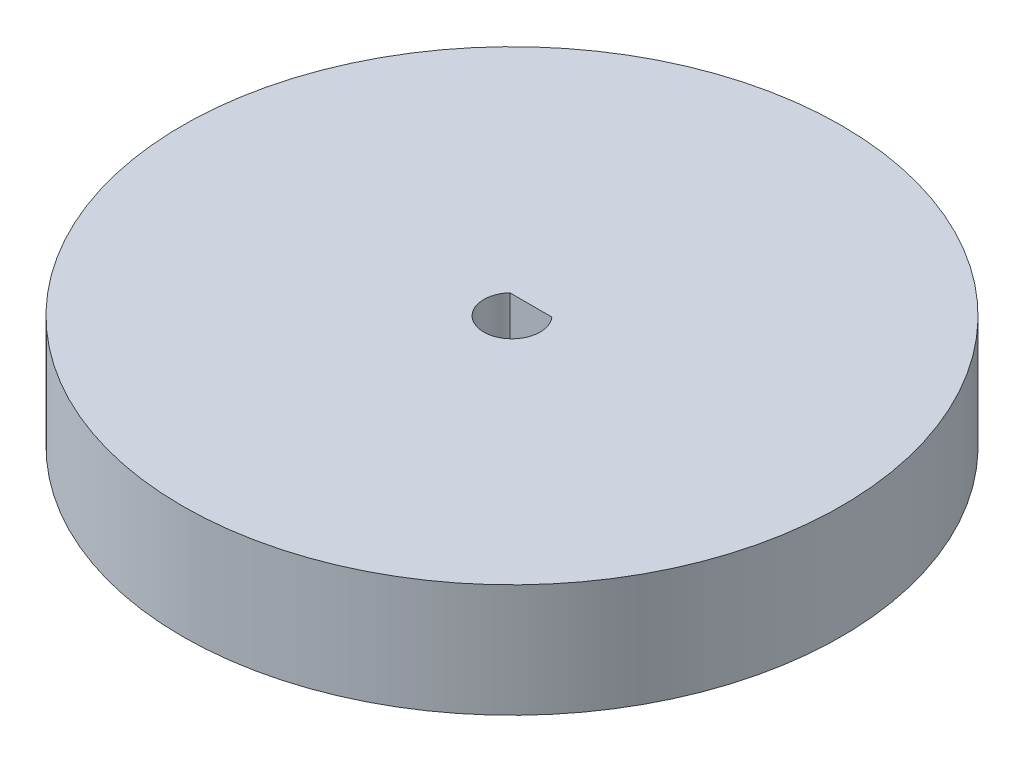
ISO-10303-21;
HEADER;
FILE_DESCRIPTION(('STEP AP214'),'2;1');
FILE_NAME('part.step','',(''),(''),'','','');
FILE_SCHEMA(('AUTOMOTIVE_DESIGN { 1 0 10303 214 1 1 1 1 }'));
ENDSEC;
DATA;
#1=APPLICATION_CONTEXT('core data for automotive mechanical design processes');
#2=APPLICATION_PROTOCOL_DEFINITION('international standard','automotive_design',2000,#1);
#3=PRODUCT_CONTEXT('',#1,'mechanical');
#4=PRODUCT('Part','Part','',(#3));
#5=PRODUCT_RELATED_PRODUCT_CATEGORY('part','',(#4));
#6=PRODUCT_DEFINITION_FORMATION('','',#4);
#7=PRODUCT_DEFINITION_CONTEXT('part definition',#1,'design');
#8=PRODUCT_DEFINITION('design','',#6,#7);
#9=PRODUCT_DEFINITION_SHAPE('','',#8);
#10=(LENGTH_UNIT() NAMED_UNIT(*) SI_UNIT(.MILLI.,.METRE.));
#11=(NAMED_UNIT(*) PLANE_ANGLE_UNIT() SI_UNIT($,.RADIAN.));
#12=(NAMED_UNIT(*) SI_UNIT($,.STERADIAN.) SOLID_ANGLE_UNIT());
#13=UNCERTAINTY_MEASURE_WITH_UNIT(LENGTH_MEASURE(1.E-05),#10,'distance_accuracy_value','');
#14=(GEOMETRIC_REPRESENTATION_CONTEXT(3) GLOBAL_UNCERTAINTY_ASSIGNED_CONTEXT((#13)) GLOBAL_UNIT_ASSIGNED_CONTEXT((#10,
#11,#12)) REPRESENTATION_CONTEXT('',''));
#15=CARTESIAN_POINT('',(0.,0.,0.));
#16=DIRECTION('',(0.,0.,1.));
#17=DIRECTION('',(1.,0.,0.));
#18=AXIS2_PLACEMENT_3D('',#15,#16,#17);
#19=CARTESIAN_POINT('',(0.,6.,0.));
#20=DIRECTION('',(0.,-1.,0.));
#21=DIRECTION('',(0.,0.,-1.));
#22=AXIS2_PLACEMENT_3D('',#19,#20,#21);
#23=CYLINDRICAL_SURFACE('',#22,1.5);
#24=CARTESIAN_POINT('',(0.,0.,0.));
#25=DIRECTION('',(0.,1.,0.));
#26=DIRECTION('',(0.,0.,1.));
#27=AXIS2_PLACEMENT_3D('',#24,#25,#26);
#28=CIRCLE('',#27,1.5);
#29=CARTESIAN_POINT('',(-1.11803398874989,0.,-1.));
#30=VERTEX_POINT('',#29);
#31=CARTESIAN_POINT('',(1.11803398874989,0.,-1.));
#32=VERTEX_POINT('',#31);
#33=EDGE_CURVE('E63',#30,#32,#28,.T.);
#34=ORIENTED_EDGE('',*,*,#33,.F.);
#35=DIRECTION('',(0.,-1.,0.));
#36=VECTOR('',#35,1.);
#37=CARTESIAN_POINT('',(-1.11803398874989,6.,-1.));
#38=LINE('',#37,#36);
#39=CARTESIAN_POINT('',(-1.11803398874989,6.,-1.));
#40=VERTEX_POINT('',#39);
#41=EDGE_CURVE('E11',#40,#30,#38,.T.);
#42=ORIENTED_EDGE('',*,*,#41,.F.);
#43=CARTESIAN_POINT('',(0.,6.,0.));
#44=DIRECTION('',(0.,1.,0.));
#45=DIRECTION('',(0.,0.,1.));
#46=AXIS2_PLACEMENT_3D('',#43,#44,#45);
#47=CIRCLE('',#46,1.5);
#48=CARTESIAN_POINT('',(1.11803398874989,6.,-1.));
#49=VERTEX_POINT('',#48);
#50=EDGE_CURVE('E64',#40,#49,#47,.T.);
#51=ORIENTED_EDGE('',*,*,#50,.T.);
#52=DIRECTION('',(0.,-1.,0.));
#53=VECTOR('',#52,1.);
#54=CARTESIAN_POINT('',(1.11803398874989,6.,-1.));
#55=LINE('',#54,#53);
#56=EDGE_CURVE('E43',#49,#32,#55,.T.);
#57=ORIENTED_EDGE('',*,*,#56,.T.);
#58=EDGE_LOOP('',(#34,#42,#51,#57));
#59=FACE_BOUND('',#58,.T.);
#60=ADVANCED_FACE('F35',(#59),#23,.F.);
#61=CARTESIAN_POINT('',(0.,6.,-1.));
#62=DIRECTION('',(0.,0.,-1.));
#63=DIRECTION('',(-1.,0.,0.));
#64=AXIS2_PLACEMENT_3D('',#61,#62,#63);
#65=PLANE('',#64);
#66=DIRECTION('',(1.,0.,0.));
#67=VECTOR('',#66,1.);
#68=CARTESIAN_POINT('',(0.,0.,-1.));
#69=LINE('',#68,#67);
#70=EDGE_CURVE('E66',#30,#32,#69,.T.);
#71=ORIENTED_EDGE('',*,*,#70,.T.);
#72=ORIENTED_EDGE('',*,*,#56,.F.);
#73=DIRECTION('',(1.,0.,0.));
#74=VECTOR('',#73,1.);
#75=CARTESIAN_POINT('',(0.,6.,-1.));
#76=LINE('',#75,#74);
#77=EDGE_CURVE('E50',#40,#49,#76,.T.);
#78=ORIENTED_EDGE('',*,*,#77,.F.);
#79=ORIENTED_EDGE('',*,*,#41,.T.);
#80=EDGE_LOOP('',(#71,#72,#78,#79));
#81=FACE_BOUND('',#80,.T.);
#82=ADVANCED_FACE('F67',(#81),#65,.F.);
#83=CARTESIAN_POINT('',(0.,6.,0.));
#84=DIRECTION('',(0.,-1.,0.));
#85=DIRECTION('',(0.,0.,-1.));
#86=AXIS2_PLACEMENT_3D('',#83,#84,#85);
#87=CYLINDRICAL_SURFACE('',#86,17.5);
#88=CARTESIAN_POINT('',(0.,6.,0.));
#89=DIRECTION('',(0.,1.,0.));
#90=DIRECTION('',(0.,0.,1.));
#91=AXIS2_PLACEMENT_3D('',#88,#89,#90);
#92=CIRCLE('',#91,17.5);
#93=CARTESIAN_POINT('',(0.,6.,17.5));
#94=VERTEX_POINT('',#93);
#95=EDGE_CURVE('E65',#94,#94,#92,.T.);
#96=ORIENTED_EDGE('',*,*,#95,.F.);
#97=EDGE_LOOP('',(#96));
#98=FACE_BOUND('',#97,.T.);
#99=CARTESIAN_POINT('',(0.,0.,0.));
#100=DIRECTION('',(0.,1.,0.));
#101=DIRECTION('',(0.,0.,1.));
#102=AXIS2_PLACEMENT_3D('',#99,#100,#101);
#103=CIRCLE('',#102,17.5);
#104=CARTESIAN_POINT('',(0.,0.,17.5));
#105=VERTEX_POINT('',#104);
#106=EDGE_CURVE('E69',#105,#105,#103,.T.);
#107=ORIENTED_EDGE('',*,*,#106,.T.);
#108=EDGE_LOOP('',(#107));
#109=FACE_BOUND('',#108,.T.);
#110=ADVANCED_FACE('F86',(#98,#109),#87,.T.);
#111=CARTESIAN_POINT('',(0.,6.,0.));
#112=DIRECTION('',(0.,1.,0.));
#113=DIRECTION('',(0.,0.,1.));
#114=AXIS2_PLACEMENT_3D('',#111,#112,#113);
#115=PLANE('',#114);
#116=ORIENTED_EDGE('',*,*,#50,.F.);
#117=ORIENTED_EDGE('',*,*,#77,.T.);
#118=EDGE_LOOP('',(#116,#117));
#119=FACE_BOUND('',#118,.T.);
#120=ORIENTED_EDGE('',*,*,#95,.T.);
#121=EDGE_LOOP('',(#120));
#122=FACE_BOUND('',#121,.T.);
#123=ADVANCED_FACE('F84',(#119,#122),#115,.T.);
#124=CARTESIAN_POINT('',(0.,0.,0.));
#125=DIRECTION('',(0.,1.,0.));
#126=DIRECTION('',(0.,0.,1.));
#127=AXIS2_PLACEMENT_3D('',#124,#125,#126);
#128=PLANE('',#127);
#129=ORIENTED_EDGE('',*,*,#33,.T.);
#130=ORIENTED_EDGE('',*,*,#70,.F.);
#131=EDGE_LOOP('',(#129,#130));
#132=FACE_BOUND('',#131,.T.);
#133=ORIENTED_EDGE('',*,*,#106,.F.);
#134=EDGE_LOOP('',(#133));
#135=FACE_BOUND('',#134,.T.);
#136=ADVANCED_FACE('F71',(#132,#135),#128,.F.);
#137=CLOSED_SHELL('',(#60,#82,#110,#123,#136));
#138=MANIFOLD_SOLID_BREP('B2',#137);
#139=ADVANCED_BREP_SHAPE_REPRESENTATION('',(#18,#138),#14);
#140=SHAPE_DEFINITION_REPRESENTATION(#9,#139);
ENDSEC;
END-ISO-10303-21;
